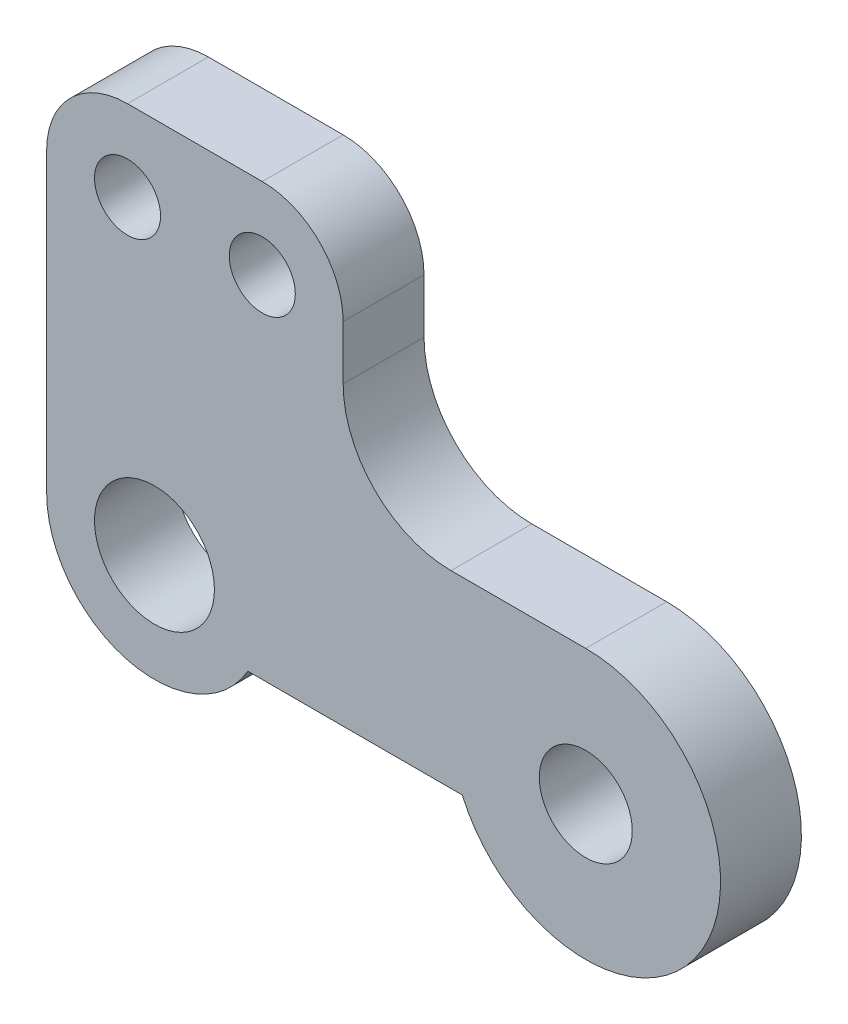
ISO-10303-21;
HEADER;
FILE_DESCRIPTION(('STEP AP214'),'2;1');
FILE_NAME('part.step','',(''),(''),'','','');
FILE_SCHEMA(('AUTOMOTIVE_DESIGN { 1 0 10303 214 1 1 1 1 }'));
ENDSEC;
DATA;
#1=APPLICATION_CONTEXT('core data for automotive mechanical design processes');
#2=APPLICATION_PROTOCOL_DEFINITION('international standard','automotive_design',2000,#1);
#3=PRODUCT_CONTEXT('',#1,'mechanical');
#4=PRODUCT('Part','Part','',(#3));
#5=PRODUCT_RELATED_PRODUCT_CATEGORY('part','',(#4));
#6=PRODUCT_DEFINITION_FORMATION('','',#4);
#7=PRODUCT_DEFINITION_CONTEXT('part definition',#1,'design');
#8=PRODUCT_DEFINITION('design','',#6,#7);
#9=PRODUCT_DEFINITION_SHAPE('','',#8);
#10=(LENGTH_UNIT() NAMED_UNIT(*) SI_UNIT(.MILLI.,.METRE.));
#11=(NAMED_UNIT(*) PLANE_ANGLE_UNIT() SI_UNIT($,.RADIAN.));
#12=(NAMED_UNIT(*) SI_UNIT($,.STERADIAN.) SOLID_ANGLE_UNIT());
#13=UNCERTAINTY_MEASURE_WITH_UNIT(LENGTH_MEASURE(1.E-05),#10,'distance_accuracy_value','');
#14=(GEOMETRIC_REPRESENTATION_CONTEXT(3) GLOBAL_UNCERTAINTY_ASSIGNED_CONTEXT((#13)) GLOBAL_UNIT_ASSIGNED_CONTEXT((#10,
#11,#12)) REPRESENTATION_CONTEXT('',''));
#15=CARTESIAN_POINT('',(0.,0.,0.));
#16=DIRECTION('',(0.,0.,1.));
#17=DIRECTION('',(1.,0.,0.));
#18=AXIS2_PLACEMENT_3D('',#15,#16,#17);
#19=CARTESIAN_POINT('',(0.,0.,3.));
#20=DIRECTION('',(0.,0.,1.));
#21=DIRECTION('',(1.,0.,0.));
#22=AXIS2_PLACEMENT_3D('',#19,#20,#21);
#23=PLANE('',#22);
#24=CARTESIAN_POINT('',(-1.,11.,3.));
#25=DIRECTION('',(0.,0.,1.));
#26=DIRECTION('',(1.,0.,0.));
#27=AXIS2_PLACEMENT_3D('',#24,#25,#26);
#28=CIRCLE('',#27,1.225);
#29=CARTESIAN_POINT('',(0.225,11.,3.));
#30=VERTEX_POINT('',#29);
#31=EDGE_CURVE('E196',#30,#30,#28,.T.);
#32=ORIENTED_EDGE('',*,*,#31,.F.);
#33=EDGE_LOOP('',(#32));
#34=FACE_BOUND('',#33,.T.);
#35=CARTESIAN_POINT('',(0.,0.,3.));
#36=DIRECTION('',(0.,0.,1.));
#37=DIRECTION('',(1.,0.,0.));
#38=AXIS2_PLACEMENT_3D('',#35,#36,#37);
#39=CIRCLE('',#38,2.225);
#40=CARTESIAN_POINT('',(2.225,0.,3.));
#41=VERTEX_POINT('',#40);
#42=EDGE_CURVE('E174',#41,#41,#39,.T.);
#43=ORIENTED_EDGE('',*,*,#42,.F.);
#44=EDGE_LOOP('',(#43));
#45=FACE_BOUND('',#44,.T.);
#46=CARTESIAN_POINT('',(0.,0.,3.));
#47=DIRECTION('',(0.,0.,1.));
#48=DIRECTION('',(1.,0.,0.));
#49=AXIS2_PLACEMENT_3D('',#46,#47,#48);
#50=CIRCLE('',#49,4.);
#51=CARTESIAN_POINT('',(-4.,0.,3.));
#52=VERTEX_POINT('',#51);
#53=CARTESIAN_POINT('',(3.46410161513775,-2.,3.));
#54=VERTEX_POINT('',#53);
#55=EDGE_CURVE('E120',#52,#54,#50,.T.);
#56=ORIENTED_EDGE('',*,*,#55,.T.);
#57=DIRECTION('',(1.,0.,0.));
#58=VECTOR('',#57,1.);
#59=CARTESIAN_POINT('',(3.46410161513775,-2.,3.));
#60=LINE('',#59,#58);
#61=CARTESIAN_POINT('',(11.4174243050442,-2.,3.));
#62=VERTEX_POINT('',#61);
#63=EDGE_CURVE('E109',#54,#62,#60,.T.);
#64=ORIENTED_EDGE('',*,*,#63,.T.);
#65=CARTESIAN_POINT('',(16.,0.,3.));
#66=DIRECTION('',(0.,0.,1.));
#67=DIRECTION('',(1.,0.,0.));
#68=AXIS2_PLACEMENT_3D('',#65,#66,#67);
#69=CIRCLE('',#68,5.);
#70=CARTESIAN_POINT('',(16.,5.,3.));
#71=VERTEX_POINT('',#70);
#72=EDGE_CURVE('E119',#62,#71,#69,.T.);
#73=ORIENTED_EDGE('',*,*,#72,.T.);
#74=DIRECTION('',(-1.,0.,0.));
#75=VECTOR('',#74,1.);
#76=CARTESIAN_POINT('',(7.,5.,3.));
#77=LINE('',#76,#75);
#78=CARTESIAN_POINT('',(11.,5.,3.));
#79=VERTEX_POINT('',#78);
#80=EDGE_CURVE('E184',#71,#79,#77,.T.);
#81=ORIENTED_EDGE('',*,*,#80,.T.);
#82=CARTESIAN_POINT('',(11.,9.,3.));
#83=DIRECTION('',(0.,0.,1.));
#84=DIRECTION('',(1.,0.,0.));
#85=AXIS2_PLACEMENT_3D('',#82,#83,#84);
#86=CIRCLE('',#85,4.);
#87=CARTESIAN_POINT('',(7.,9.,3.));
#88=VERTEX_POINT('',#87);
#89=EDGE_CURVE('E11',#79,#88,#86,.F.);
#90=ORIENTED_EDGE('',*,*,#89,.T.);
#91=DIRECTION('',(0.,1.,0.));
#92=VECTOR('',#91,1.);
#93=CARTESIAN_POINT('',(7.,11.,3.));
#94=LINE('',#93,#92);
#95=CARTESIAN_POINT('',(7.,11.,3.));
#96=VERTEX_POINT('',#95);
#97=EDGE_CURVE('E182',#88,#96,#94,.T.);
#98=ORIENTED_EDGE('',*,*,#97,.T.);
#99=CARTESIAN_POINT('',(4.,11.,3.));
#100=DIRECTION('',(0.,0.,1.));
#101=DIRECTION('',(1.,0.,0.));
#102=AXIS2_PLACEMENT_3D('',#99,#100,#101);
#103=CIRCLE('',#102,3.);
#104=CARTESIAN_POINT('',(4.,14.,3.));
#105=VERTEX_POINT('',#104);
#106=EDGE_CURVE('E180',#96,#105,#103,.T.);
#107=ORIENTED_EDGE('',*,*,#106,.T.);
#108=DIRECTION('',(-1.,0.,0.));
#109=VECTOR('',#108,1.);
#110=CARTESIAN_POINT('',(-1.,14.,3.));
#111=LINE('',#110,#109);
#112=CARTESIAN_POINT('',(-1.,14.,3.));
#113=VERTEX_POINT('',#112);
#114=EDGE_CURVE('E178',#105,#113,#111,.T.);
#115=ORIENTED_EDGE('',*,*,#114,.T.);
#116=CARTESIAN_POINT('',(-1.,11.,3.));
#117=DIRECTION('',(0.,0.,1.));
#118=DIRECTION('',(1.,0.,0.));
#119=AXIS2_PLACEMENT_3D('',#116,#117,#118);
#120=CIRCLE('',#119,3.);
#121=CARTESIAN_POINT('',(-4.,11.,3.));
#122=VERTEX_POINT('',#121);
#123=EDGE_CURVE('E176',#113,#122,#120,.T.);
#124=ORIENTED_EDGE('',*,*,#123,.T.);
#125=DIRECTION('',(0.,-1.,0.));
#126=VECTOR('',#125,1.);
#127=CARTESIAN_POINT('',(-4.,11.,3.));
#128=LINE('',#127,#126);
#129=EDGE_CURVE('E125',#122,#52,#128,.T.);
#130=ORIENTED_EDGE('',*,*,#129,.T.);
#131=EDGE_LOOP('',(#56,#64,#73,#81,#90,#98,#107,#115,#124,#130));
#132=FACE_BOUND('',#131,.T.);
#133=CARTESIAN_POINT('',(16.,0.,3.));
#134=DIRECTION('',(0.,0.,1.));
#135=DIRECTION('',(1.,0.,0.));
#136=AXIS2_PLACEMENT_3D('',#133,#134,#135);
#137=CIRCLE('',#136,1.725);
#138=CARTESIAN_POINT('',(17.725,0.,3.));
#139=VERTEX_POINT('',#138);
#140=EDGE_CURVE('E190',#139,#139,#137,.T.);
#141=ORIENTED_EDGE('',*,*,#140,.F.);
#142=EDGE_LOOP('',(#141));
#143=FACE_BOUND('',#142,.T.);
#144=CARTESIAN_POINT('',(4.,11.,3.));
#145=DIRECTION('',(0.,0.,1.));
#146=DIRECTION('',(1.,0.,0.));
#147=AXIS2_PLACEMENT_3D('',#144,#145,#146);
#148=CIRCLE('',#147,1.225);
#149=CARTESIAN_POINT('',(5.225,11.,3.));
#150=VERTEX_POINT('',#149);
#151=EDGE_CURVE('E202',#150,#150,#148,.T.);
#152=ORIENTED_EDGE('',*,*,#151,.F.);
#153=EDGE_LOOP('',(#152));
#154=FACE_BOUND('',#153,.T.);
#155=ADVANCED_FACE('F32',(#34,#45,#132,#143,#154),#23,.T.);
#156=CARTESIAN_POINT('',(0.,0.,0.));
#157=DIRECTION('',(0.,0.,1.));
#158=DIRECTION('',(1.,0.,0.));
#159=AXIS2_PLACEMENT_3D('',#156,#157,#158);
#160=PLANE('',#159);
#161=CARTESIAN_POINT('',(-1.,11.,0.));
#162=DIRECTION('',(0.,0.,1.));
#163=DIRECTION('',(1.,0.,0.));
#164=AXIS2_PLACEMENT_3D('',#161,#162,#163);
#165=CIRCLE('',#164,1.225);
#166=CARTESIAN_POINT('',(0.225,11.,0.));
#167=VERTEX_POINT('',#166);
#168=EDGE_CURVE('E199',#167,#167,#165,.T.);
#169=ORIENTED_EDGE('',*,*,#168,.T.);
#170=EDGE_LOOP('',(#169));
#171=FACE_BOUND('',#170,.T.);
#172=CARTESIAN_POINT('',(0.,0.,0.));
#173=DIRECTION('',(0.,0.,1.));
#174=DIRECTION('',(1.,0.,0.));
#175=AXIS2_PLACEMENT_3D('',#172,#173,#174);
#176=CIRCLE('',#175,2.225);
#177=CARTESIAN_POINT('',(2.225,0.,0.));
#178=VERTEX_POINT('',#177);
#179=EDGE_CURVE('E187',#178,#178,#176,.T.);
#180=ORIENTED_EDGE('',*,*,#179,.T.);
#181=EDGE_LOOP('',(#180));
#182=FACE_BOUND('',#181,.T.);
#183=CARTESIAN_POINT('',(0.,0.,0.));
#184=DIRECTION('',(0.,0.,1.));
#185=DIRECTION('',(1.,0.,0.));
#186=AXIS2_PLACEMENT_3D('',#183,#184,#185);
#187=CIRCLE('',#186,4.);
#188=CARTESIAN_POINT('',(-4.,0.,0.));
#189=VERTEX_POINT('',#188);
#190=CARTESIAN_POINT('',(3.46410161513775,-2.,0.));
#191=VERTEX_POINT('',#190);
#192=EDGE_CURVE('E133',#189,#191,#187,.T.);
#193=ORIENTED_EDGE('',*,*,#192,.F.);
#194=DIRECTION('',(0.,-1.,0.));
#195=VECTOR('',#194,1.);
#196=CARTESIAN_POINT('',(-4.,11.,0.));
#197=LINE('',#196,#195);
#198=CARTESIAN_POINT('',(-4.,11.,0.));
#199=VERTEX_POINT('',#198);
#200=EDGE_CURVE('E129',#199,#189,#197,.T.);
#201=ORIENTED_EDGE('',*,*,#200,.F.);
#202=CARTESIAN_POINT('',(-1.,11.,0.));
#203=DIRECTION('',(0.,0.,1.));
#204=DIRECTION('',(1.,0.,0.));
#205=AXIS2_PLACEMENT_3D('',#202,#203,#204);
#206=CIRCLE('',#205,3.);
#207=CARTESIAN_POINT('',(-1.,14.,0.));
#208=VERTEX_POINT('',#207);
#209=EDGE_CURVE('E159',#208,#199,#206,.T.);
#210=ORIENTED_EDGE('',*,*,#209,.F.);
#211=DIRECTION('',(-1.,0.,0.));
#212=VECTOR('',#211,1.);
#213=CARTESIAN_POINT('',(-1.,14.,0.));
#214=LINE('',#213,#212);
#215=CARTESIAN_POINT('',(4.,14.,0.));
#216=VERTEX_POINT('',#215);
#217=EDGE_CURVE('E161',#216,#208,#214,.T.);
#218=ORIENTED_EDGE('',*,*,#217,.F.);
#219=CARTESIAN_POINT('',(4.,11.,0.));
#220=DIRECTION('',(0.,0.,1.));
#221=DIRECTION('',(1.,0.,0.));
#222=AXIS2_PLACEMENT_3D('',#219,#220,#221);
#223=CIRCLE('',#222,3.);
#224=CARTESIAN_POINT('',(7.,11.,0.));
#225=VERTEX_POINT('',#224);
#226=EDGE_CURVE('E163',#225,#216,#223,.T.);
#227=ORIENTED_EDGE('',*,*,#226,.F.);
#228=DIRECTION('',(0.,1.,0.));
#229=VECTOR('',#228,1.);
#230=CARTESIAN_POINT('',(7.,11.,0.));
#231=LINE('',#230,#229);
#232=CARTESIAN_POINT('',(7.,9.,0.));
#233=VERTEX_POINT('',#232);
#234=EDGE_CURVE('E165',#233,#225,#231,.T.);
#235=ORIENTED_EDGE('',*,*,#234,.F.);
#236=CARTESIAN_POINT('',(11.,9.,0.));
#237=DIRECTION('',(0.,0.,1.));
#238=DIRECTION('',(1.,0.,0.));
#239=AXIS2_PLACEMENT_3D('',#236,#237,#238);
#240=CIRCLE('',#239,4.);
#241=CARTESIAN_POINT('',(11.,5.,0.));
#242=VERTEX_POINT('',#241);
#243=EDGE_CURVE('E40',#233,#242,#240,.T.);
#244=ORIENTED_EDGE('',*,*,#243,.T.);
#245=DIRECTION('',(-1.,0.,0.));
#246=VECTOR('',#245,1.);
#247=CARTESIAN_POINT('',(7.,5.,0.));
#248=LINE('',#247,#246);
#249=CARTESIAN_POINT('',(16.,5.,0.));
#250=VERTEX_POINT('',#249);
#251=EDGE_CURVE('E167',#250,#242,#248,.T.);
#252=ORIENTED_EDGE('',*,*,#251,.F.);
#253=CARTESIAN_POINT('',(16.,0.,0.));
#254=DIRECTION('',(0.,0.,1.));
#255=DIRECTION('',(1.,0.,0.));
#256=AXIS2_PLACEMENT_3D('',#253,#254,#255);
#257=CIRCLE('',#256,5.);
#258=CARTESIAN_POINT('',(11.4174243050442,-2.,0.));
#259=VERTEX_POINT('',#258);
#260=EDGE_CURVE('E169',#259,#250,#257,.T.);
#261=ORIENTED_EDGE('',*,*,#260,.F.);
#262=DIRECTION('',(1.,0.,0.));
#263=VECTOR('',#262,1.);
#264=CARTESIAN_POINT('',(3.46410161513775,-2.,0.));
#265=LINE('',#264,#263);
#266=EDGE_CURVE('E171',#191,#259,#265,.T.);
#267=ORIENTED_EDGE('',*,*,#266,.F.);
#268=EDGE_LOOP('',(#193,#201,#210,#218,#227,#235,#244,#252,#261,#267));
#269=FACE_BOUND('',#268,.T.);
#270=CARTESIAN_POINT('',(16.,0.,0.));
#271=DIRECTION('',(0.,0.,1.));
#272=DIRECTION('',(1.,0.,0.));
#273=AXIS2_PLACEMENT_3D('',#270,#271,#272);
#274=CIRCLE('',#273,1.725);
#275=CARTESIAN_POINT('',(17.725,0.,0.));
#276=VERTEX_POINT('',#275);
#277=EDGE_CURVE('E193',#276,#276,#274,.T.);
#278=ORIENTED_EDGE('',*,*,#277,.T.);
#279=EDGE_LOOP('',(#278));
#280=FACE_BOUND('',#279,.T.);
#281=CARTESIAN_POINT('',(4.,11.,0.));
#282=DIRECTION('',(0.,0.,1.));
#283=DIRECTION('',(1.,0.,0.));
#284=AXIS2_PLACEMENT_3D('',#281,#282,#283);
#285=CIRCLE('',#284,1.225);
#286=CARTESIAN_POINT('',(5.225,11.,0.));
#287=VERTEX_POINT('',#286);
#288=EDGE_CURVE('E205',#287,#287,#285,.T.);
#289=ORIENTED_EDGE('',*,*,#288,.T.);
#290=EDGE_LOOP('',(#289));
#291=FACE_BOUND('',#290,.T.);
#292=ADVANCED_FACE('F215',(#171,#182,#269,#280,#291),#160,.F.);
#293=CARTESIAN_POINT('',(0.,0.,3.));
#294=DIRECTION('',(0.,0.,-1.));
#295=DIRECTION('',(-1.,0.,0.));
#296=AXIS2_PLACEMENT_3D('',#293,#294,#295);
#297=CYLINDRICAL_SURFACE('',#296,4.);
#298=ORIENTED_EDGE('',*,*,#192,.T.);
#299=DIRECTION('',(0.,0.,-1.));
#300=VECTOR('',#299,1.);
#301=CARTESIAN_POINT('',(3.46410161513775,-2.,3.));
#302=LINE('',#301,#300);
#303=EDGE_CURVE('E113',#54,#191,#302,.T.);
#304=ORIENTED_EDGE('',*,*,#303,.F.);
#305=ORIENTED_EDGE('',*,*,#55,.F.);
#306=DIRECTION('',(0.,0.,-1.));
#307=VECTOR('',#306,1.);
#308=CARTESIAN_POINT('',(-4.,0.,3.));
#309=LINE('',#308,#307);
#310=EDGE_CURVE('E156',#52,#189,#309,.T.);
#311=ORIENTED_EDGE('',*,*,#310,.T.);
#312=EDGE_LOOP('',(#298,#304,#305,#311));
#313=FACE_BOUND('',#312,.T.);
#314=ADVANCED_FACE('F131',(#313),#297,.T.);
#315=CARTESIAN_POINT('',(3.46410161513775,-2.,3.));
#316=DIRECTION('',(0.,1.,0.));
#317=DIRECTION('',(0.,0.,1.));
#318=AXIS2_PLACEMENT_3D('',#315,#316,#317);
#319=PLANE('',#318);
#320=ORIENTED_EDGE('',*,*,#266,.T.);
#321=DIRECTION('',(0.,0.,-1.));
#322=VECTOR('',#321,1.);
#323=CARTESIAN_POINT('',(11.4174243050442,-2.,3.));
#324=LINE('',#323,#322);
#325=EDGE_CURVE('E116',#62,#259,#324,.T.);
#326=ORIENTED_EDGE('',*,*,#325,.F.);
#327=ORIENTED_EDGE('',*,*,#63,.F.);
#328=ORIENTED_EDGE('',*,*,#303,.T.);
#329=EDGE_LOOP('',(#320,#326,#327,#328));
#330=FACE_BOUND('',#329,.T.);
#331=ADVANCED_FACE('F111',(#330),#319,.F.);
#332=CARTESIAN_POINT('',(16.,0.,3.));
#333=DIRECTION('',(0.,0.,-1.));
#334=DIRECTION('',(-1.,0.,0.));
#335=AXIS2_PLACEMENT_3D('',#332,#333,#334);
#336=CYLINDRICAL_SURFACE('',#335,5.);
#337=ORIENTED_EDGE('',*,*,#260,.T.);
#338=DIRECTION('',(0.,0.,-1.));
#339=VECTOR('',#338,1.);
#340=CARTESIAN_POINT('',(16.,5.,3.));
#341=LINE('',#340,#339);
#342=EDGE_CURVE('E138',#71,#250,#341,.T.);
#343=ORIENTED_EDGE('',*,*,#342,.F.);
#344=ORIENTED_EDGE('',*,*,#72,.F.);
#345=ORIENTED_EDGE('',*,*,#325,.T.);
#346=EDGE_LOOP('',(#337,#343,#344,#345));
#347=FACE_BOUND('',#346,.T.);
#348=ADVANCED_FACE('F252',(#347),#336,.T.);
#349=CARTESIAN_POINT('',(7.,5.,3.));
#350=DIRECTION('',(0.,-1.,0.));
#351=DIRECTION('',(0.,0.,-1.));
#352=AXIS2_PLACEMENT_3D('',#349,#350,#351);
#353=PLANE('',#352);
#354=ORIENTED_EDGE('',*,*,#251,.T.);
#355=DIRECTION('',(0.,0.,-1.));
#356=VECTOR('',#355,1.);
#357=CARTESIAN_POINT('',(11.,5.,3.));
#358=LINE('',#357,#356);
#359=EDGE_CURVE('E47',#242,#79,#358,.F.);
#360=ORIENTED_EDGE('',*,*,#359,.T.);
#361=ORIENTED_EDGE('',*,*,#80,.F.);
#362=ORIENTED_EDGE('',*,*,#342,.T.);
#363=EDGE_LOOP('',(#354,#360,#361,#362));
#364=FACE_BOUND('',#363,.T.);
#365=ADVANCED_FACE('F248',(#364),#353,.F.);
#366=CARTESIAN_POINT('',(7.,11.,3.));
#367=DIRECTION('',(-1.,0.,0.));
#368=DIRECTION('',(0.,-1.,0.));
#369=AXIS2_PLACEMENT_3D('',#366,#367,#368);
#370=PLANE('',#369);
#371=ORIENTED_EDGE('',*,*,#97,.F.);
#372=DIRECTION('',(0.,0.,-1.));
#373=VECTOR('',#372,1.);
#374=CARTESIAN_POINT('',(7.,9.,0.));
#375=LINE('',#374,#373);
#376=EDGE_CURVE('E134',#88,#233,#375,.T.);
#377=ORIENTED_EDGE('',*,*,#376,.T.);
#378=ORIENTED_EDGE('',*,*,#234,.T.);
#379=DIRECTION('',(0.,0.,-1.));
#380=VECTOR('',#379,1.);
#381=CARTESIAN_POINT('',(7.,11.,3.));
#382=LINE('',#381,#380);
#383=EDGE_CURVE('E144',#96,#225,#382,.T.);
#384=ORIENTED_EDGE('',*,*,#383,.F.);
#385=EDGE_LOOP('',(#371,#377,#378,#384));
#386=FACE_BOUND('',#385,.T.);
#387=ADVANCED_FACE('F244',(#386),#370,.F.);
#388=CARTESIAN_POINT('',(4.,11.,3.));
#389=DIRECTION('',(0.,0.,-1.));
#390=DIRECTION('',(-1.,0.,0.));
#391=AXIS2_PLACEMENT_3D('',#388,#389,#390);
#392=CYLINDRICAL_SURFACE('',#391,3.);
#393=ORIENTED_EDGE('',*,*,#226,.T.);
#394=DIRECTION('',(0.,0.,-1.));
#395=VECTOR('',#394,1.);
#396=CARTESIAN_POINT('',(4.,14.,3.));
#397=LINE('',#396,#395);
#398=EDGE_CURVE('E147',#105,#216,#397,.T.);
#399=ORIENTED_EDGE('',*,*,#398,.F.);
#400=ORIENTED_EDGE('',*,*,#106,.F.);
#401=ORIENTED_EDGE('',*,*,#383,.T.);
#402=EDGE_LOOP('',(#393,#399,#400,#401));
#403=FACE_BOUND('',#402,.T.);
#404=ADVANCED_FACE('F240',(#403),#392,.T.);
#405=CARTESIAN_POINT('',(-1.,14.,3.));
#406=DIRECTION('',(0.,-1.,0.));
#407=DIRECTION('',(0.,0.,-1.));
#408=AXIS2_PLACEMENT_3D('',#405,#406,#407);
#409=PLANE('',#408);
#410=ORIENTED_EDGE('',*,*,#217,.T.);
#411=DIRECTION('',(0.,0.,-1.));
#412=VECTOR('',#411,1.);
#413=CARTESIAN_POINT('',(-1.,14.,3.));
#414=LINE('',#413,#412);
#415=EDGE_CURVE('E150',#113,#208,#414,.T.);
#416=ORIENTED_EDGE('',*,*,#415,.F.);
#417=ORIENTED_EDGE('',*,*,#114,.F.);
#418=ORIENTED_EDGE('',*,*,#398,.T.);
#419=EDGE_LOOP('',(#410,#416,#417,#418));
#420=FACE_BOUND('',#419,.T.);
#421=ADVANCED_FACE('F236',(#420),#409,.F.);
#422=CARTESIAN_POINT('',(-1.,11.,3.));
#423=DIRECTION('',(0.,0.,-1.));
#424=DIRECTION('',(-1.,0.,0.));
#425=AXIS2_PLACEMENT_3D('',#422,#423,#424);
#426=CYLINDRICAL_SURFACE('',#425,3.);
#427=ORIENTED_EDGE('',*,*,#209,.T.);
#428=DIRECTION('',(0.,0.,-1.));
#429=VECTOR('',#428,1.);
#430=CARTESIAN_POINT('',(-4.,11.,3.));
#431=LINE('',#430,#429);
#432=EDGE_CURVE('E153',#122,#199,#431,.T.);
#433=ORIENTED_EDGE('',*,*,#432,.F.);
#434=ORIENTED_EDGE('',*,*,#123,.F.);
#435=ORIENTED_EDGE('',*,*,#415,.T.);
#436=EDGE_LOOP('',(#427,#433,#434,#435));
#437=FACE_BOUND('',#436,.T.);
#438=ADVANCED_FACE('F232',(#437),#426,.T.);
#439=CARTESIAN_POINT('',(-4.,11.,3.));
#440=DIRECTION('',(1.,0.,0.));
#441=DIRECTION('',(0.,1.,0.));
#442=AXIS2_PLACEMENT_3D('',#439,#440,#441);
#443=PLANE('',#442);
#444=ORIENTED_EDGE('',*,*,#200,.T.);
#445=ORIENTED_EDGE('',*,*,#310,.F.);
#446=ORIENTED_EDGE('',*,*,#129,.F.);
#447=ORIENTED_EDGE('',*,*,#432,.T.);
#448=EDGE_LOOP('',(#444,#445,#446,#447));
#449=FACE_BOUND('',#448,.T.);
#450=ADVANCED_FACE('F229',(#449),#443,.F.);
#451=CARTESIAN_POINT('',(0.,0.,3.));
#452=DIRECTION('',(0.,0.,-1.));
#453=DIRECTION('',(-1.,0.,0.));
#454=AXIS2_PLACEMENT_3D('',#451,#452,#453);
#455=CYLINDRICAL_SURFACE('',#454,2.225);
#456=ORIENTED_EDGE('',*,*,#42,.T.);
#457=EDGE_LOOP('',(#456));
#458=FACE_BOUND('',#457,.T.);
#459=ORIENTED_EDGE('',*,*,#179,.F.);
#460=EDGE_LOOP('',(#459));
#461=FACE_BOUND('',#460,.T.);
#462=ADVANCED_FACE('F226',(#458,#461),#455,.F.);
#463=CARTESIAN_POINT('',(16.,0.,3.));
#464=DIRECTION('',(0.,0.,-1.));
#465=DIRECTION('',(-1.,0.,0.));
#466=AXIS2_PLACEMENT_3D('',#463,#464,#465);
#467=CYLINDRICAL_SURFACE('',#466,1.725);
#468=ORIENTED_EDGE('',*,*,#140,.T.);
#469=EDGE_LOOP('',(#468));
#470=FACE_BOUND('',#469,.T.);
#471=ORIENTED_EDGE('',*,*,#277,.F.);
#472=EDGE_LOOP('',(#471));
#473=FACE_BOUND('',#472,.T.);
#474=ADVANCED_FACE('F301',(#470,#473),#467,.F.);
#475=CARTESIAN_POINT('',(-1.,11.,3.));
#476=DIRECTION('',(0.,0.,-1.));
#477=DIRECTION('',(-1.,0.,0.));
#478=AXIS2_PLACEMENT_3D('',#475,#476,#477);
#479=CYLINDRICAL_SURFACE('',#478,1.225);
#480=ORIENTED_EDGE('',*,*,#31,.T.);
#481=EDGE_LOOP('',(#480));
#482=FACE_BOUND('',#481,.T.);
#483=ORIENTED_EDGE('',*,*,#168,.F.);
#484=EDGE_LOOP('',(#483));
#485=FACE_BOUND('',#484,.T.);
#486=ADVANCED_FACE('F308',(#482,#485),#479,.F.);
#487=CARTESIAN_POINT('',(4.,11.,3.));
#488=DIRECTION('',(0.,0.,-1.));
#489=DIRECTION('',(-1.,0.,0.));
#490=AXIS2_PLACEMENT_3D('',#487,#488,#489);
#491=CYLINDRICAL_SURFACE('',#490,1.225);
#492=ORIENTED_EDGE('',*,*,#151,.T.);
#493=EDGE_LOOP('',(#492));
#494=FACE_BOUND('',#493,.T.);
#495=ORIENTED_EDGE('',*,*,#288,.F.);
#496=EDGE_LOOP('',(#495));
#497=FACE_BOUND('',#496,.T.);
#498=ADVANCED_FACE('F211',(#494,#497),#491,.F.);
#499=CARTESIAN_POINT('',(11.,9.,3.));
#500=DIRECTION('',(0.,0.,1.));
#501=DIRECTION('',(1.,0.,0.));
#502=AXIS2_PLACEMENT_3D('',#499,#500,#501);
#503=CYLINDRICAL_SURFACE('',#502,4.);
#504=ORIENTED_EDGE('',*,*,#89,.F.);
#505=ORIENTED_EDGE('',*,*,#359,.F.);
#506=ORIENTED_EDGE('',*,*,#243,.F.);
#507=ORIENTED_EDGE('',*,*,#376,.F.);
#508=EDGE_LOOP('',(#504,#505,#506,#507));
#509=FACE_BOUND('',#508,.T.);
#510=ADVANCED_FACE('F34',(#509),#503,.F.);
#511=CLOSED_SHELL('',(#155,#292,#314,#331,#348,#365,#387,#404,#421,#438,#450,#462,#474,#486,
#498,#510));
#512=MANIFOLD_SOLID_BREP('B2',#511);
#513=ADVANCED_BREP_SHAPE_REPRESENTATION('',(#18,#512),#14);
#514=SHAPE_DEFINITION_REPRESENTATION(#9,#513);
ENDSEC;
END-ISO-10303-21;
